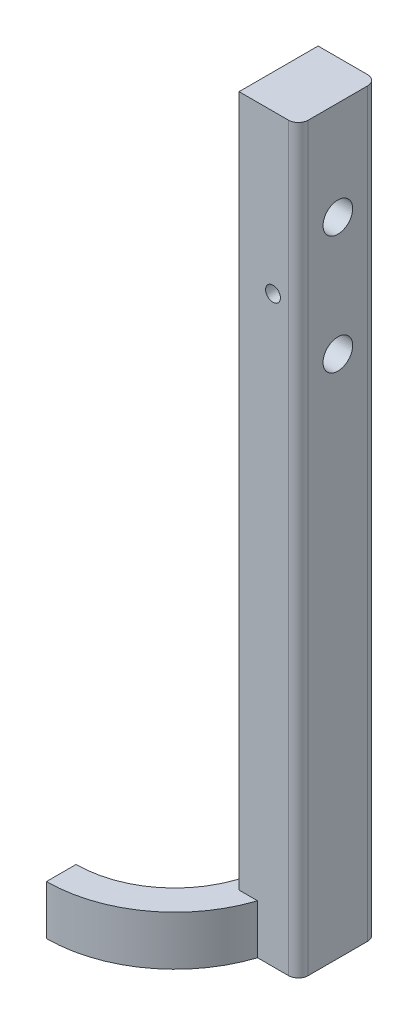
ISO-10303-21;
HEADER;
FILE_DESCRIPTION(('STEP AP214'),'2;1');
FILE_NAME('part.step','',(''),(''),'','','');
FILE_SCHEMA(('AUTOMOTIVE_DESIGN { 1 0 10303 214 1 1 1 1 }'));
ENDSEC;
DATA;
#1=APPLICATION_CONTEXT('core data for automotive mechanical design processes');
#2=APPLICATION_PROTOCOL_DEFINITION('international standard','automotive_design',2000,#1);
#3=PRODUCT_CONTEXT('',#1,'mechanical');
#4=PRODUCT('Part','Part','',(#3));
#5=PRODUCT_RELATED_PRODUCT_CATEGORY('part','',(#4));
#6=PRODUCT_DEFINITION_FORMATION('','',#4);
#7=PRODUCT_DEFINITION_CONTEXT('part definition',#1,'design');
#8=PRODUCT_DEFINITION('design','',#6,#7);
#9=PRODUCT_DEFINITION_SHAPE('','',#8);
#10=(LENGTH_UNIT() NAMED_UNIT(*) SI_UNIT(.MILLI.,.METRE.));
#11=(NAMED_UNIT(*) PLANE_ANGLE_UNIT() SI_UNIT($,.RADIAN.));
#12=(NAMED_UNIT(*) SI_UNIT($,.STERADIAN.) SOLID_ANGLE_UNIT());
#13=UNCERTAINTY_MEASURE_WITH_UNIT(LENGTH_MEASURE(1.E-05),#10,'distance_accuracy_value','');
#14=(GEOMETRIC_REPRESENTATION_CONTEXT(3) GLOBAL_UNCERTAINTY_ASSIGNED_CONTEXT((#13)) GLOBAL_UNIT_ASSIGNED_CONTEXT((#10,
#11,#12)) REPRESENTATION_CONTEXT('',''));
#15=CARTESIAN_POINT('',(0.,0.,0.));
#16=DIRECTION('',(0.,0.,1.));
#17=DIRECTION('',(1.,0.,0.));
#18=AXIS2_PLACEMENT_3D('',#15,#16,#17);
#19=CARTESIAN_POINT('',(0.,5.,0.));
#20=DIRECTION('',(0.,-1.,0.));
#21=DIRECTION('',(0.,0.,-1.));
#22=AXIS2_PLACEMENT_3D('',#19,#20,#21);
#23=CYLINDRICAL_SURFACE('',#22,13.);
#24=DIRECTION('',(0.,-1.,0.));
#25=VECTOR('',#24,1.);
#26=CARTESIAN_POINT('',(12.369316876853,5.,-4.));
#27=LINE('',#26,#25);
#28=CARTESIAN_POINT('',(12.369316876853,0.,-4.));
#29=VERTEX_POINT('',#28);
#30=CARTESIAN_POINT('',(12.369316876853,5.,-4.));
#31=VERTEX_POINT('',#30);
#32=EDGE_CURVE('E301',#29,#31,#27,.F.);
#33=ORIENTED_EDGE('',*,*,#32,.F.);
#34=CARTESIAN_POINT('',(0.,0.,0.));
#35=DIRECTION('',(0.,1.,0.));
#36=DIRECTION('',(0.,0.,1.));
#37=AXIS2_PLACEMENT_3D('',#34,#35,#36);
#38=CIRCLE('',#37,13.);
#39=CARTESIAN_POINT('',(0.,0.,-13.));
#40=VERTEX_POINT('',#39);
#41=EDGE_CURVE('E305',#29,#40,#38,.T.);
#42=ORIENTED_EDGE('',*,*,#41,.T.);
#43=DIRECTION('',(0.,-1.,0.));
#44=VECTOR('',#43,1.);
#45=CARTESIAN_POINT('',(0.,5.,-13.));
#46=LINE('',#45,#44);
#47=CARTESIAN_POINT('',(0.,5.,-13.));
#48=VERTEX_POINT('',#47);
#49=EDGE_CURVE('E315',#48,#40,#46,.T.);
#50=ORIENTED_EDGE('',*,*,#49,.F.);
#51=CARTESIAN_POINT('',(0.,5.,0.));
#52=DIRECTION('',(0.,1.,0.));
#53=DIRECTION('',(0.,0.,1.));
#54=AXIS2_PLACEMENT_3D('',#51,#52,#53);
#55=CIRCLE('',#54,13.);
#56=EDGE_CURVE('E100',#31,#48,#55,.T.);
#57=ORIENTED_EDGE('',*,*,#56,.F.);
#58=EDGE_LOOP('',(#33,#42,#50,#57));
#59=FACE_BOUND('',#58,.T.);
#60=ADVANCED_FACE('F53',(#59),#23,.T.);
#61=DIRECTION('',(0.,-1.,0.));
#62=VECTOR('',#61,1.);
#63=CARTESIAN_POINT('',(12.369316876853,5.,4.));
#64=LINE('',#63,#62);
#65=CARTESIAN_POINT('',(12.369316876853,5.,4.));
#66=VERTEX_POINT('',#65);
#67=CARTESIAN_POINT('',(12.369316876853,0.,4.));
#68=VERTEX_POINT('',#67);
#69=EDGE_CURVE('E290',#66,#68,#64,.T.);
#70=ORIENTED_EDGE('',*,*,#69,.F.);
#71=CARTESIAN_POINT('',(0.,5.,13.));
#72=VERTEX_POINT('',#71);
#73=EDGE_CURVE('E178',#72,#66,#55,.T.);
#74=ORIENTED_EDGE('',*,*,#73,.F.);
#75=DIRECTION('',(0.,-1.,0.));
#76=VECTOR('',#75,1.);
#77=CARTESIAN_POINT('',(0.,5.,13.));
#78=LINE('',#77,#76);
#79=CARTESIAN_POINT('',(0.,0.,13.));
#80=VERTEX_POINT('',#79);
#81=EDGE_CURVE('E182',#72,#80,#78,.T.);
#82=ORIENTED_EDGE('',*,*,#81,.T.);
#83=EDGE_CURVE('E174',#80,#68,#38,.T.);
#84=ORIENTED_EDGE('',*,*,#83,.T.);
#85=EDGE_LOOP('',(#70,#74,#82,#84));
#86=FACE_BOUND('',#85,.T.);
#87=ADVANCED_FACE('F337',(#86),#23,.T.);
#88=CARTESIAN_POINT('',(0.,5.,0.));
#89=DIRECTION('',(0.,1.,0.));
#90=DIRECTION('',(0.,0.,1.));
#91=AXIS2_PLACEMENT_3D('',#88,#89,#90);
#92=PLANE('',#91);
#93=DIRECTION('',(0.,0.,-1.));
#94=VECTOR('',#93,1.);
#95=CARTESIAN_POINT('',(10.5,5.,0.));
#96=LINE('',#95,#94);
#97=CARTESIAN_POINT('',(10.5,5.,4.));
#98=VERTEX_POINT('',#97);
#99=CARTESIAN_POINT('',(10.5,5.,-4.));
#100=VERTEX_POINT('',#99);
#101=EDGE_CURVE('E294',#98,#100,#96,.T.);
#102=ORIENTED_EDGE('',*,*,#101,.T.);
#103=DIRECTION('',(1.,0.,0.));
#104=VECTOR('',#103,1.);
#105=CARTESIAN_POINT('',(0.,5.,-4.));
#106=LINE('',#105,#104);
#107=EDGE_CURVE('E298',#100,#31,#106,.T.);
#108=ORIENTED_EDGE('',*,*,#107,.T.);
#109=ORIENTED_EDGE('',*,*,#56,.T.);
#110=DIRECTION('',(0.,0.,1.));
#111=VECTOR('',#110,1.);
#112=CARTESIAN_POINT('',(0.,5.,-13.));
#113=LINE('',#112,#111);
#114=CARTESIAN_POINT('',(0.,5.,-10.));
#115=VERTEX_POINT('',#114);
#116=EDGE_CURVE('E94',#48,#115,#113,.T.);
#117=ORIENTED_EDGE('',*,*,#116,.T.);
#118=CARTESIAN_POINT('',(0.,5.,0.));
#119=DIRECTION('',(0.,1.,0.));
#120=DIRECTION('',(0.,0.,1.));
#121=AXIS2_PLACEMENT_3D('',#118,#119,#120);
#122=CIRCLE('',#121,10.);
#123=CARTESIAN_POINT('',(0.,5.,10.));
#124=VERTEX_POINT('',#123);
#125=EDGE_CURVE('E177',#115,#124,#122,.F.);
#126=ORIENTED_EDGE('',*,*,#125,.T.);
#127=DIRECTION('',(0.,0.,1.));
#128=VECTOR('',#127,1.);
#129=CARTESIAN_POINT('',(0.,5.,10.));
#130=LINE('',#129,#128);
#131=EDGE_CURVE('E179',#124,#72,#130,.T.);
#132=ORIENTED_EDGE('',*,*,#131,.T.);
#133=ORIENTED_EDGE('',*,*,#73,.T.);
#134=DIRECTION('',(-1.,0.,0.));
#135=VECTOR('',#134,1.);
#136=CARTESIAN_POINT('',(0.,5.,4.));
#137=LINE('',#136,#135);
#138=EDGE_CURVE('E286',#66,#98,#137,.T.);
#139=ORIENTED_EDGE('',*,*,#138,.T.);
#140=EDGE_LOOP('',(#102,#108,#109,#117,#126,#132,#133,#139));
#141=FACE_BOUND('',#140,.T.);
#142=ADVANCED_FACE('F340',(#141),#92,.T.);
#143=CARTESIAN_POINT('',(0.,5.,-13.));
#144=DIRECTION('',(1.,0.,0.));
#145=DIRECTION('',(0.,0.,-1.));
#146=AXIS2_PLACEMENT_3D('',#143,#144,#145);
#147=PLANE('',#146);
#148=DIRECTION('',(0.,-1.,0.));
#149=VECTOR('',#148,1.);
#150=CARTESIAN_POINT('',(0.,3.,-8.5));
#151=LINE('',#150,#149);
#152=CARTESIAN_POINT('',(0.,3.,-8.5));
#153=VERTEX_POINT('',#152);
#154=CARTESIAN_POINT('',(0.,2.,-8.5));
#155=VERTEX_POINT('',#154);
#156=EDGE_CURVE('E195',#153,#155,#151,.T.);
#157=ORIENTED_EDGE('',*,*,#156,.F.);
#158=DIRECTION('',(0.,-0.8,0.6));
#159=VECTOR('',#158,1.);
#160=CARTESIAN_POINT('',(0.,5.,-10.));
#161=LINE('',#160,#159);
#162=EDGE_CURVE('E359',#115,#153,#161,.T.);
#163=ORIENTED_EDGE('',*,*,#162,.F.);
#164=ORIENTED_EDGE('',*,*,#116,.F.);
#165=ORIENTED_EDGE('',*,*,#49,.T.);
#166=DIRECTION('',(0.,0.,1.));
#167=VECTOR('',#166,1.);
#168=CARTESIAN_POINT('',(0.,0.,-13.));
#169=LINE('',#168,#167);
#170=CARTESIAN_POINT('',(0.,0.,-10.));
#171=VERTEX_POINT('',#170);
#172=EDGE_CURVE('E171',#40,#171,#169,.T.);
#173=ORIENTED_EDGE('',*,*,#172,.T.);
#174=DIRECTION('',(0.,0.8,0.6));
#175=VECTOR('',#174,1.);
#176=CARTESIAN_POINT('',(0.,0.,-10.));
#177=LINE('',#176,#175);
#178=EDGE_CURVE('E356',#171,#155,#177,.T.);
#179=ORIENTED_EDGE('',*,*,#178,.T.);
#180=EDGE_LOOP('',(#157,#163,#164,#165,#173,#179));
#181=FACE_BOUND('',#180,.T.);
#182=ADVANCED_FACE('F398',(#181),#147,.F.);
#183=CARTESIAN_POINT('',(0.,5.,10.));
#184=DIRECTION('',(1.,0.,0.));
#185=DIRECTION('',(0.,0.,-1.));
#186=AXIS2_PLACEMENT_3D('',#183,#184,#185);
#187=PLANE('',#186);
#188=DIRECTION('',(0.,-0.8,-0.6));
#189=VECTOR('',#188,1.);
#190=CARTESIAN_POINT('',(0.,5.,10.));
#191=LINE('',#190,#189);
#192=CARTESIAN_POINT('',(0.,3.,8.5));
#193=VERTEX_POINT('',#192);
#194=EDGE_CURVE('E358',#124,#193,#191,.T.);
#195=ORIENTED_EDGE('',*,*,#194,.T.);
#196=DIRECTION('',(0.,-1.,0.));
#197=VECTOR('',#196,1.);
#198=CARTESIAN_POINT('',(0.,3.,8.5));
#199=LINE('',#198,#197);
#200=CARTESIAN_POINT('',(0.,2.,8.5));
#201=VERTEX_POINT('',#200);
#202=EDGE_CURVE('E188',#193,#201,#199,.T.);
#203=ORIENTED_EDGE('',*,*,#202,.T.);
#204=DIRECTION('',(0.,0.8,-0.6));
#205=VECTOR('',#204,1.);
#206=CARTESIAN_POINT('',(0.,0.,10.));
#207=LINE('',#206,#205);
#208=CARTESIAN_POINT('',(0.,0.,10.));
#209=VERTEX_POINT('',#208);
#210=EDGE_CURVE('E354',#209,#201,#207,.T.);
#211=ORIENTED_EDGE('',*,*,#210,.F.);
#212=DIRECTION('',(0.,0.,1.));
#213=VECTOR('',#212,1.);
#214=CARTESIAN_POINT('',(0.,0.,10.));
#215=LINE('',#214,#213);
#216=EDGE_CURVE('E167',#209,#80,#215,.T.);
#217=ORIENTED_EDGE('',*,*,#216,.T.);
#218=ORIENTED_EDGE('',*,*,#81,.F.);
#219=ORIENTED_EDGE('',*,*,#131,.F.);
#220=EDGE_LOOP('',(#195,#203,#211,#217,#218,#219));
#221=FACE_BOUND('',#220,.T.);
#222=ADVANCED_FACE('F346',(#221),#187,.F.);
#223=CARTESIAN_POINT('',(0.,0.,0.));
#224=DIRECTION('',(0.,1.,0.));
#225=DIRECTION('',(0.,0.,1.));
#226=AXIS2_PLACEMENT_3D('',#223,#224,#225);
#227=PLANE('',#226);
#228=DIRECTION('',(-1.,0.,0.));
#229=VECTOR('',#228,1.);
#230=CARTESIAN_POINT('',(16.5,0.,-4.));
#231=LINE('',#230,#229);
#232=CARTESIAN_POINT('',(15.5,0.,-4.));
#233=VERTEX_POINT('',#232);
#234=EDGE_CURVE('E274',#233,#29,#231,.T.);
#235=ORIENTED_EDGE('',*,*,#234,.F.);
#236=CARTESIAN_POINT('',(15.5,0.,-3.));
#237=DIRECTION('',(0.,1.,0.));
#238=DIRECTION('',(0.,0.,1.));
#239=AXIS2_PLACEMENT_3D('',#236,#237,#238);
#240=CIRCLE('',#239,1.);
#241=CARTESIAN_POINT('',(16.5,0.,-3.));
#242=VERTEX_POINT('',#241);
#243=EDGE_CURVE('E157',#233,#242,#240,.F.);
#244=ORIENTED_EDGE('',*,*,#243,.T.);
#245=DIRECTION('',(0.,0.,-1.));
#246=VECTOR('',#245,1.);
#247=CARTESIAN_POINT('',(16.5,0.,-4.));
#248=LINE('',#247,#246);
#249=CARTESIAN_POINT('',(16.5,0.,3.));
#250=VERTEX_POINT('',#249);
#251=EDGE_CURVE('E251',#250,#242,#248,.T.);
#252=ORIENTED_EDGE('',*,*,#251,.F.);
#253=CARTESIAN_POINT('',(15.5,0.,3.));
#254=DIRECTION('',(0.,1.,0.));
#255=DIRECTION('',(0.,0.,1.));
#256=AXIS2_PLACEMENT_3D('',#253,#254,#255);
#257=CIRCLE('',#256,1.);
#258=CARTESIAN_POINT('',(15.5,0.,4.));
#259=VERTEX_POINT('',#258);
#260=EDGE_CURVE('E155',#250,#259,#257,.F.);
#261=ORIENTED_EDGE('',*,*,#260,.T.);
#262=DIRECTION('',(1.,0.,0.));
#263=VECTOR('',#262,1.);
#264=CARTESIAN_POINT('',(16.5,0.,4.));
#265=LINE('',#264,#263);
#266=EDGE_CURVE('E153',#68,#259,#265,.T.);
#267=ORIENTED_EDGE('',*,*,#266,.F.);
#268=ORIENTED_EDGE('',*,*,#83,.F.);
#269=ORIENTED_EDGE('',*,*,#216,.F.);
#270=CARTESIAN_POINT('',(0.,0.,0.));
#271=DIRECTION('',(0.,-1.,0.));
#272=DIRECTION('',(0.,0.,-1.));
#273=AXIS2_PLACEMENT_3D('',#270,#271,#272);
#274=CIRCLE('',#273,10.);
#275=EDGE_CURVE('E170',#171,#209,#274,.T.);
#276=ORIENTED_EDGE('',*,*,#275,.F.);
#277=ORIENTED_EDGE('',*,*,#172,.F.);
#278=ORIENTED_EDGE('',*,*,#41,.F.);
#279=EDGE_LOOP('',(#235,#244,#252,#261,#267,#268,#269,#276,#277,#278));
#280=FACE_BOUND('',#279,.T.);
#281=ADVANCED_FACE('F326',(#280),#227,.F.);
#282=CARTESIAN_POINT('',(16.5,75.,-4.));
#283=DIRECTION('',(0.,0.,1.));
#284=DIRECTION('',(1.,0.,0.));
#285=AXIS2_PLACEMENT_3D('',#282,#283,#284);
#286=PLANE('',#285);
#287=CARTESIAN_POINT('',(13.9346584384265,59.,-4.));
#288=DIRECTION('',(0.,0.,1.));
#289=DIRECTION('',(1.,0.,0.));
#290=AXIS2_PLACEMENT_3D('',#287,#288,#289);
#291=CIRCLE('',#290,0.75);
#292=CARTESIAN_POINT('',(14.6846584384265,59.,-4.));
#293=VERTEX_POINT('',#292);
#294=EDGE_CURVE('E594',#293,#293,#291,.T.);
#295=ORIENTED_EDGE('',*,*,#294,.T.);
#296=EDGE_LOOP('',(#295));
#297=FACE_BOUND('',#296,.T.);
#298=DIRECTION('',(-1.,0.,0.));
#299=VECTOR('',#298,1.);
#300=CARTESIAN_POINT('',(16.5,75.,-4.));
#301=LINE('',#300,#299);
#302=CARTESIAN_POINT('',(15.5,75.,-4.));
#303=VERTEX_POINT('',#302);
#304=CARTESIAN_POINT('',(10.5,75.,-4.));
#305=VERTEX_POINT('',#304);
#306=EDGE_CURVE('E152',#303,#305,#301,.T.);
#307=ORIENTED_EDGE('',*,*,#306,.F.);
#308=DIRECTION('',(0.,-1.,0.));
#309=VECTOR('',#308,1.);
#310=CARTESIAN_POINT('',(15.5,75.,-4.));
#311=LINE('',#310,#309);
#312=EDGE_CURVE('E319',#303,#233,#311,.T.);
#313=ORIENTED_EDGE('',*,*,#312,.T.);
#314=ORIENTED_EDGE('',*,*,#234,.T.);
#315=ORIENTED_EDGE('',*,*,#32,.T.);
#316=ORIENTED_EDGE('',*,*,#107,.F.);
#317=DIRECTION('',(0.,-1.,0.));
#318=VECTOR('',#317,1.);
#319=CARTESIAN_POINT('',(10.5,75.,-4.));
#320=LINE('',#319,#318);
#321=EDGE_CURVE('E282',#305,#100,#320,.T.);
#322=ORIENTED_EDGE('',*,*,#321,.F.);
#323=EDGE_LOOP('',(#307,#313,#314,#315,#316,#322));
#324=FACE_BOUND('',#323,.T.);
#325=ADVANCED_FACE('F408',(#297,#324),#286,.F.);
#326=CARTESIAN_POINT('',(16.5,75.,4.));
#327=DIRECTION('',(0.,0.,-1.));
#328=DIRECTION('',(-1.,0.,0.));
#329=AXIS2_PLACEMENT_3D('',#326,#327,#328);
#330=PLANE('',#329);
#331=CARTESIAN_POINT('',(13.9346584384265,59.,4.));
#332=DIRECTION('',(0.,0.,1.));
#333=DIRECTION('',(1.,0.,0.));
#334=AXIS2_PLACEMENT_3D('',#331,#332,#333);
#335=CIRCLE('',#334,0.75);
#336=CARTESIAN_POINT('',(14.6846584384265,59.,4.));
#337=VERTEX_POINT('',#336);
#338=EDGE_CURVE('E591',#337,#337,#335,.T.);
#339=ORIENTED_EDGE('',*,*,#338,.F.);
#340=EDGE_LOOP('',(#339));
#341=FACE_BOUND('',#340,.T.);
#342=ORIENTED_EDGE('',*,*,#266,.T.);
#343=DIRECTION('',(0.,-1.,0.));
#344=VECTOR('',#343,1.);
#345=CARTESIAN_POINT('',(15.5,75.,4.));
#346=LINE('',#345,#344);
#347=CARTESIAN_POINT('',(15.5,75.,4.));
#348=VERTEX_POINT('',#347);
#349=EDGE_CURVE('E12',#259,#348,#346,.F.);
#350=ORIENTED_EDGE('',*,*,#349,.T.);
#351=DIRECTION('',(1.,0.,0.));
#352=VECTOR('',#351,1.);
#353=CARTESIAN_POINT('',(16.5,75.,4.));
#354=LINE('',#353,#352);
#355=CARTESIAN_POINT('',(10.5,75.,4.));
#356=VERTEX_POINT('',#355);
#357=EDGE_CURVE('E138',#356,#348,#354,.T.);
#358=ORIENTED_EDGE('',*,*,#357,.F.);
#359=DIRECTION('',(0.,-1.,0.));
#360=VECTOR('',#359,1.);
#361=CARTESIAN_POINT('',(10.5,75.,4.));
#362=LINE('',#361,#360);
#363=EDGE_CURVE('E271',#356,#98,#362,.T.);
#364=ORIENTED_EDGE('',*,*,#363,.T.);
#365=ORIENTED_EDGE('',*,*,#138,.F.);
#366=ORIENTED_EDGE('',*,*,#69,.T.);
#367=EDGE_LOOP('',(#342,#350,#358,#364,#365,#366));
#368=FACE_BOUND('',#367,.T.);
#369=ADVANCED_FACE('F329',(#341,#368),#330,.F.);
#370=CARTESIAN_POINT('',(16.5,75.,-4.));
#371=DIRECTION('',(-1.,0.,0.));
#372=DIRECTION('',(0.,0.,1.));
#373=AXIS2_PLACEMENT_3D('',#370,#371,#372);
#374=PLANE('',#373);
#375=CARTESIAN_POINT('',(16.5,65.,0.));
#376=DIRECTION('',(-1.,0.,0.));
#377=DIRECTION('',(0.,0.,1.));
#378=AXIS2_PLACEMENT_3D('',#375,#376,#377);
#379=CIRCLE('',#378,1.5);
#380=CARTESIAN_POINT('',(16.5,65.,1.5));
#381=VERTEX_POINT('',#380);
#382=EDGE_CURVE('E242',#381,#381,#379,.T.);
#383=ORIENTED_EDGE('',*,*,#382,.T.);
#384=EDGE_LOOP('',(#383));
#385=FACE_BOUND('',#384,.T.);
#386=CARTESIAN_POINT('',(16.5,53.,0.));
#387=DIRECTION('',(-1.,0.,0.));
#388=DIRECTION('',(0.,0.,1.));
#389=AXIS2_PLACEMENT_3D('',#386,#387,#388);
#390=CIRCLE('',#389,1.5);
#391=CARTESIAN_POINT('',(16.5,53.,1.5));
#392=VERTEX_POINT('',#391);
#393=EDGE_CURVE('E256',#392,#392,#390,.T.);
#394=ORIENTED_EDGE('',*,*,#393,.T.);
#395=EDGE_LOOP('',(#394));
#396=FACE_BOUND('',#395,.T.);
#397=ORIENTED_EDGE('',*,*,#251,.T.);
#398=DIRECTION('',(0.,-1.,0.));
#399=VECTOR('',#398,1.);
#400=CARTESIAN_POINT('',(16.5,75.,-3.));
#401=LINE('',#400,#399);
#402=CARTESIAN_POINT('',(16.5,75.,-3.));
#403=VERTEX_POINT('',#402);
#404=EDGE_CURVE('E142',#242,#403,#401,.F.);
#405=ORIENTED_EDGE('',*,*,#404,.T.);
#406=DIRECTION('',(0.,0.,-1.));
#407=VECTOR('',#406,1.);
#408=CARTESIAN_POINT('',(16.5,75.,-4.));
#409=LINE('',#408,#407);
#410=CARTESIAN_POINT('',(16.5,75.,3.));
#411=VERTEX_POINT('',#410);
#412=EDGE_CURVE('E135',#411,#403,#409,.T.);
#413=ORIENTED_EDGE('',*,*,#412,.F.);
#414=DIRECTION('',(0.,-1.,0.));
#415=VECTOR('',#414,1.);
#416=CARTESIAN_POINT('',(16.5,75.,3.));
#417=LINE('',#416,#415);
#418=EDGE_CURVE('E148',#411,#250,#417,.T.);
#419=ORIENTED_EDGE('',*,*,#418,.T.);
#420=EDGE_LOOP('',(#397,#405,#413,#419));
#421=FACE_BOUND('',#420,.T.);
#422=ADVANCED_FACE('F147',(#385,#396,#421),#374,.F.);
#423=CARTESIAN_POINT('',(10.5,75.,-4.));
#424=DIRECTION('',(1.,0.,0.));
#425=DIRECTION('',(0.,0.,-1.));
#426=AXIS2_PLACEMENT_3D('',#423,#424,#425);
#427=PLANE('',#426);
#428=CARTESIAN_POINT('',(10.5,65.,0.));
#429=DIRECTION('',(-1.,0.,0.));
#430=DIRECTION('',(0.,0.,1.));
#431=AXIS2_PLACEMENT_3D('',#428,#429,#430);
#432=CIRCLE('',#431,1.5);
#433=CARTESIAN_POINT('',(10.5,65.,1.5));
#434=VERTEX_POINT('',#433);
#435=EDGE_CURVE('E252',#434,#434,#432,.T.);
#436=ORIENTED_EDGE('',*,*,#435,.F.);
#437=EDGE_LOOP('',(#436));
#438=FACE_BOUND('',#437,.T.);
#439=CARTESIAN_POINT('',(10.5,53.,0.));
#440=DIRECTION('',(-1.,0.,0.));
#441=DIRECTION('',(0.,0.,1.));
#442=AXIS2_PLACEMENT_3D('',#439,#440,#441);
#443=CIRCLE('',#442,1.5);
#444=CARTESIAN_POINT('',(10.5,53.,1.5));
#445=VERTEX_POINT('',#444);
#446=EDGE_CURVE('E199',#445,#445,#443,.T.);
#447=ORIENTED_EDGE('',*,*,#446,.F.);
#448=EDGE_LOOP('',(#447));
#449=FACE_BOUND('',#448,.T.);
#450=ORIENTED_EDGE('',*,*,#101,.F.);
#451=ORIENTED_EDGE('',*,*,#363,.F.);
#452=DIRECTION('',(0.,0.,1.));
#453=VECTOR('',#452,1.);
#454=CARTESIAN_POINT('',(10.5,75.,-4.));
#455=LINE('',#454,#453);
#456=EDGE_CURVE('E266',#305,#356,#455,.T.);
#457=ORIENTED_EDGE('',*,*,#456,.F.);
#458=ORIENTED_EDGE('',*,*,#321,.T.);
#459=EDGE_LOOP('',(#450,#451,#457,#458));
#460=FACE_BOUND('',#459,.T.);
#461=ADVANCED_FACE('F413',(#438,#449,#460),#427,.F.);
#462=CARTESIAN_POINT('',(0.,75.,0.));
#463=DIRECTION('',(0.,-1.,0.));
#464=DIRECTION('',(0.,0.,-1.));
#465=AXIS2_PLACEMENT_3D('',#462,#463,#464);
#466=PLANE('',#465);
#467=ORIENTED_EDGE('',*,*,#412,.T.);
#468=CARTESIAN_POINT('',(15.5,75.,-3.));
#469=DIRECTION('',(0.,-1.,0.));
#470=DIRECTION('',(0.,0.,-1.));
#471=AXIS2_PLACEMENT_3D('',#468,#469,#470);
#472=CIRCLE('',#471,1.);
#473=EDGE_CURVE('E65',#403,#303,#472,.F.);
#474=ORIENTED_EDGE('',*,*,#473,.T.);
#475=ORIENTED_EDGE('',*,*,#306,.T.);
#476=ORIENTED_EDGE('',*,*,#456,.T.);
#477=ORIENTED_EDGE('',*,*,#357,.T.);
#478=CARTESIAN_POINT('',(15.5,75.,3.));
#479=DIRECTION('',(0.,-1.,0.));
#480=DIRECTION('',(0.,0.,-1.));
#481=AXIS2_PLACEMENT_3D('',#478,#479,#480);
#482=CIRCLE('',#481,1.);
#483=EDGE_CURVE('E132',#348,#411,#482,.F.);
#484=ORIENTED_EDGE('',*,*,#483,.T.);
#485=EDGE_LOOP('',(#467,#474,#475,#476,#477,#484));
#486=FACE_BOUND('',#485,.T.);
#487=ADVANCED_FACE('F134',(#486),#466,.F.);
#488=CARTESIAN_POINT('',(15.5,75.,-3.));
#489=DIRECTION('',(0.,-1.,0.));
#490=DIRECTION('',(0.,0.,-1.));
#491=AXIS2_PLACEMENT_3D('',#488,#489,#490);
#492=CYLINDRICAL_SURFACE('',#491,1.);
#493=ORIENTED_EDGE('',*,*,#473,.F.);
#494=ORIENTED_EDGE('',*,*,#404,.F.);
#495=ORIENTED_EDGE('',*,*,#243,.F.);
#496=ORIENTED_EDGE('',*,*,#312,.F.);
#497=EDGE_LOOP('',(#493,#494,#495,#496));
#498=FACE_BOUND('',#497,.T.);
#499=ADVANCED_FACE('F417',(#498),#492,.T.);
#500=CARTESIAN_POINT('',(15.5,75.,3.));
#501=DIRECTION('',(0.,-1.,0.));
#502=DIRECTION('',(0.,0.,-1.));
#503=AXIS2_PLACEMENT_3D('',#500,#501,#502);
#504=CYLINDRICAL_SURFACE('',#503,1.);
#505=ORIENTED_EDGE('',*,*,#483,.F.);
#506=ORIENTED_EDGE('',*,*,#349,.F.);
#507=ORIENTED_EDGE('',*,*,#260,.F.);
#508=ORIENTED_EDGE('',*,*,#418,.F.);
#509=EDGE_LOOP('',(#505,#506,#507,#508));
#510=FACE_BOUND('',#509,.T.);
#511=ADVANCED_FACE('F55',(#510),#504,.T.);
#512=CARTESIAN_POINT('',(16.5,53.,0.));
#513=DIRECTION('',(-1.,0.,0.));
#514=DIRECTION('',(0.,0.,1.));
#515=AXIS2_PLACEMENT_3D('',#512,#513,#514);
#516=CYLINDRICAL_SURFACE('',#515,1.5);
#517=ORIENTED_EDGE('',*,*,#393,.F.);
#518=EDGE_LOOP('',(#517));
#519=FACE_BOUND('',#518,.T.);
#520=ORIENTED_EDGE('',*,*,#446,.T.);
#521=EDGE_LOOP('',(#520));
#522=FACE_BOUND('',#521,.T.);
#523=ADVANCED_FACE('F423',(#519,#522),#516,.F.);
#524=CARTESIAN_POINT('',(16.5,65.,0.));
#525=DIRECTION('',(-1.,0.,0.));
#526=DIRECTION('',(0.,0.,1.));
#527=AXIS2_PLACEMENT_3D('',#524,#525,#526);
#528=CYLINDRICAL_SURFACE('',#527,1.5);
#529=ORIENTED_EDGE('',*,*,#382,.F.);
#530=EDGE_LOOP('',(#529));
#531=FACE_BOUND('',#530,.T.);
#532=ORIENTED_EDGE('',*,*,#435,.T.);
#533=EDGE_LOOP('',(#532));
#534=FACE_BOUND('',#533,.T.);
#535=ADVANCED_FACE('F234',(#531,#534),#528,.F.);
#536=CARTESIAN_POINT('',(0.,3.,0.));
#537=DIRECTION('',(0.,-1.,0.));
#538=DIRECTION('',(0.,0.,-1.));
#539=AXIS2_PLACEMENT_3D('',#536,#537,#538);
#540=CYLINDRICAL_SURFACE('',#539,8.5);
#541=CARTESIAN_POINT('',(0.,2.,0.));
#542=DIRECTION('',(0.,-1.,0.));
#543=DIRECTION('',(0.,0.,1.));
#544=AXIS2_PLACEMENT_3D('',#541,#542,#543);
#545=CIRCLE('',#544,8.5);
#546=EDGE_CURVE('E57',#155,#201,#545,.T.);
#547=ORIENTED_EDGE('',*,*,#546,.T.);
#548=ORIENTED_EDGE('',*,*,#202,.F.);
#549=CARTESIAN_POINT('',(0.,3.,0.));
#550=DIRECTION('',(0.,-1.,0.));
#551=DIRECTION('',(0.,0.,1.));
#552=AXIS2_PLACEMENT_3D('',#549,#550,#551);
#553=CIRCLE('',#552,8.5);
#554=EDGE_CURVE('E192',#153,#193,#553,.T.);
#555=ORIENTED_EDGE('',*,*,#554,.F.);
#556=ORIENTED_EDGE('',*,*,#156,.T.);
#557=EDGE_LOOP('',(#547,#548,#555,#556));
#558=FACE_BOUND('',#557,.T.);
#559=ADVANCED_FACE('F223',(#558),#540,.F.);
#560=CARTESIAN_POINT('',(0.,5.,0.));
#561=DIRECTION('',(0.,1.,0.));
#562=DIRECTION('',(0.,0.,1.));
#563=AXIS2_PLACEMENT_3D('',#560,#561,#562);
#564=CONICAL_SURFACE('',#563,10.,0.643501108793284);
#565=ORIENTED_EDGE('',*,*,#162,.T.);
#566=ORIENTED_EDGE('',*,*,#554,.T.);
#567=ORIENTED_EDGE('',*,*,#194,.F.);
#568=ORIENTED_EDGE('',*,*,#125,.F.);
#569=EDGE_LOOP('',(#565,#566,#567,#568));
#570=FACE_BOUND('',#569,.T.);
#571=ADVANCED_FACE('F233',(#570),#564,.F.);
#572=CARTESIAN_POINT('',(0.,0.,0.));
#573=DIRECTION('',(0.,-1.,0.));
#574=DIRECTION('',(0.,0.,-1.));
#575=AXIS2_PLACEMENT_3D('',#572,#573,#574);
#576=CONICAL_SURFACE('',#575,10.,0.643501108793284);
#577=ORIENTED_EDGE('',*,*,#210,.T.);
#578=ORIENTED_EDGE('',*,*,#546,.F.);
#579=ORIENTED_EDGE('',*,*,#178,.F.);
#580=ORIENTED_EDGE('',*,*,#275,.T.);
#581=EDGE_LOOP('',(#577,#578,#579,#580));
#582=FACE_BOUND('',#581,.T.);
#583=ADVANCED_FACE('F235',(#582),#576,.F.);
#584=CARTESIAN_POINT('',(13.9346584384265,59.,-13.));
#585=DIRECTION('',(0.,0.,1.));
#586=DIRECTION('',(1.,0.,0.));
#587=AXIS2_PLACEMENT_3D('',#584,#585,#586);
#588=CYLINDRICAL_SURFACE('',#587,0.75);
#589=ORIENTED_EDGE('',*,*,#338,.T.);
#590=EDGE_LOOP('',(#589));
#591=FACE_BOUND('',#590,.T.);
#592=ORIENTED_EDGE('',*,*,#294,.F.);
#593=EDGE_LOOP('',(#592));
#594=FACE_BOUND('',#593,.T.);
#595=ADVANCED_FACE('F489',(#591,#594),#588,.F.);
#596=CLOSED_SHELL('',(#60,#87,#142,#182,#222,#281,#325,#369,#422,#461,#487,#499,#511,#523,#535,
#559,#571,#583,#595));
#597=MANIFOLD_SOLID_BREP('B2',#596);
#598=ADVANCED_BREP_SHAPE_REPRESENTATION('',(#18,#597),#14);
#599=SHAPE_DEFINITION_REPRESENTATION(#9,#598);
ENDSEC;
END-ISO-10303-21;
